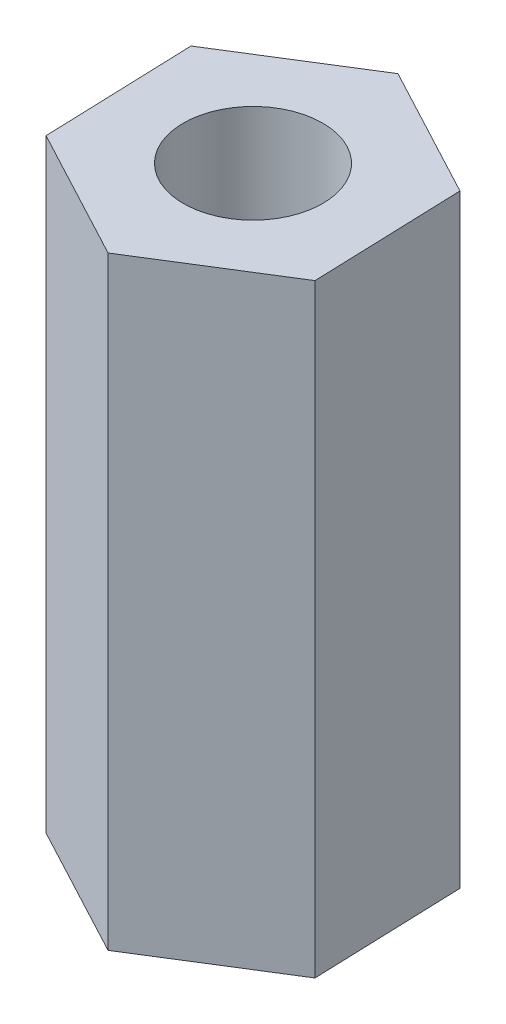
ISO-10303-21;
HEADER;
FILE_DESCRIPTION(('STEP AP214'),'2;1');
FILE_NAME('part.step','',(''),(''),'','','');
FILE_SCHEMA(('AUTOMOTIVE_DESIGN { 1 0 10303 214 1 1 1 1 }'));
ENDSEC;
DATA;
#1=APPLICATION_CONTEXT('core data for automotive mechanical design processes');
#2=APPLICATION_PROTOCOL_DEFINITION('international standard','automotive_design',2000,#1);
#3=PRODUCT_CONTEXT('',#1,'mechanical');
#4=PRODUCT('Part','Part','',(#3));
#5=PRODUCT_RELATED_PRODUCT_CATEGORY('part','',(#4));
#6=PRODUCT_DEFINITION_FORMATION('','',#4);
#7=PRODUCT_DEFINITION_CONTEXT('part definition',#1,'design');
#8=PRODUCT_DEFINITION('design','',#6,#7);
#9=PRODUCT_DEFINITION_SHAPE('','',#8);
#10=(LENGTH_UNIT() NAMED_UNIT(*) SI_UNIT(.MILLI.,.METRE.));
#11=(NAMED_UNIT(*) PLANE_ANGLE_UNIT() SI_UNIT($,.RADIAN.));
#12=(NAMED_UNIT(*) SI_UNIT($,.STERADIAN.) SOLID_ANGLE_UNIT());
#13=UNCERTAINTY_MEASURE_WITH_UNIT(LENGTH_MEASURE(1.E-05),#10,'distance_accuracy_value','');
#14=(GEOMETRIC_REPRESENTATION_CONTEXT(3) GLOBAL_UNCERTAINTY_ASSIGNED_CONTEXT((#13)) GLOBAL_UNIT_ASSIGNED_CONTEXT((#10,
#11,#12)) REPRESENTATION_CONTEXT('',''));
#15=CARTESIAN_POINT('',(0.,0.,0.));
#16=DIRECTION('',(0.,0.,1.));
#17=DIRECTION('',(1.,0.,0.));
#18=AXIS2_PLACEMENT_3D('',#15,#16,#17);
#19=CARTESIAN_POINT('',(0.,13.,0.));
#20=DIRECTION('',(0.,1.,0.));
#21=DIRECTION('',(0.,0.,1.));
#22=AXIS2_PLACEMENT_3D('',#19,#20,#21);
#23=PLANE('',#22);
#24=DIRECTION('',(0.848274620016122,0.,-0.529556577748312));
#25=VECTOR('',#24,1.);
#26=CARTESIAN_POINT('',(0.111453993098776,13.,3.23123990764472));
#27=LINE('',#26,#25);
#28=CARTESIAN_POINT('',(0.111453993098776,13.,3.23123990764472));
#29=VERTEX_POINT('',#28);
#30=CARTESIAN_POINT('',(2.8540628422918,13.,1.5190979644456));
#31=VERTEX_POINT('',#30);
#32=EDGE_CURVE('E137',#29,#31,#27,.T.);
#33=ORIENTED_EDGE('',*,*,#32,.T.);
#34=DIRECTION('',(-0.0344721390631268,0.,-0.999405659193709));
#35=VECTOR('',#34,1.);
#36=CARTESIAN_POINT('',(2.8540628422918,13.,1.5190979644456));
#37=LINE('',#36,#35);
#38=CARTESIAN_POINT('',(2.74260884919302,13.,-1.71214194319912));
#39=VERTEX_POINT('',#38);
#40=EDGE_CURVE('E95',#31,#39,#37,.T.);
#41=ORIENTED_EDGE('',*,*,#40,.T.);
#42=DIRECTION('',(-0.882746759079248,0.,-0.469849081445397));
#43=VECTOR('',#42,1.);
#44=CARTESIAN_POINT('',(2.74260884919302,13.,-1.71214194319912));
#45=LINE('',#44,#43);
#46=CARTESIAN_POINT('',(-0.111453993098776,13.,-3.23123990764472));
#47=VERTEX_POINT('',#46);
#48=EDGE_CURVE('E108',#39,#47,#45,.T.);
#49=ORIENTED_EDGE('',*,*,#48,.T.);
#50=DIRECTION('',(-0.848274620016122,0.,0.529556577748312));
#51=VECTOR('',#50,1.);
#52=CARTESIAN_POINT('',(-0.111453993098776,13.,-3.23123990764472));
#53=LINE('',#52,#51);
#54=CARTESIAN_POINT('',(-2.8540628422918,13.,-1.5190979644456));
#55=VERTEX_POINT('',#54);
#56=EDGE_CURVE('E102',#47,#55,#53,.T.);
#57=ORIENTED_EDGE('',*,*,#56,.T.);
#58=DIRECTION('',(0.0344721390631268,0.,0.999405659193709));
#59=VECTOR('',#58,1.);
#60=CARTESIAN_POINT('',(-2.8540628422918,13.,-1.5190979644456));
#61=LINE('',#60,#59);
#62=CARTESIAN_POINT('',(-2.74260884919302,13.,1.71214194319912));
#63=VERTEX_POINT('',#62);
#64=EDGE_CURVE('E106',#55,#63,#61,.T.);
#65=ORIENTED_EDGE('',*,*,#64,.T.);
#66=DIRECTION('',(0.882746759079248,0.,0.469849081445397));
#67=VECTOR('',#66,1.);
#68=CARTESIAN_POINT('',(-2.74260884919302,13.,1.71214194319912));
#69=LINE('',#68,#67);
#70=EDGE_CURVE('E58',#63,#29,#69,.T.);
#71=ORIENTED_EDGE('',*,*,#70,.T.);
#72=EDGE_LOOP('',(#33,#41,#49,#57,#65,#71));
#73=FACE_BOUND('',#72,.T.);
#74=CARTESIAN_POINT('',(0.,13.,0.));
#75=DIRECTION('',(0.,1.,0.));
#76=DIRECTION('',(0.,0.,1.));
#77=AXIS2_PLACEMENT_3D('',#74,#75,#76);
#78=CIRCLE('',#77,1.5);
#79=CARTESIAN_POINT('',(0.,13.,-1.5));
#80=VERTEX_POINT('',#79);
#81=EDGE_CURVE('E130',#80,#80,#78,.T.);
#82=ORIENTED_EDGE('',*,*,#81,.F.);
#83=EDGE_LOOP('',(#82));
#84=FACE_BOUND('',#83,.T.);
#85=ADVANCED_FACE('F41',(#73,#84),#23,.T.);
#86=CARTESIAN_POINT('',(0.,0.,0.));
#87=DIRECTION('',(0.,1.,0.));
#88=DIRECTION('',(0.,0.,1.));
#89=AXIS2_PLACEMENT_3D('',#86,#87,#88);
#90=PLANE('',#89);
#91=DIRECTION('',(0.848274620016122,0.,-0.529556577748312));
#92=VECTOR('',#91,1.);
#93=CARTESIAN_POINT('',(0.111453993098776,0.,3.23123990764472));
#94=LINE('',#93,#92);
#95=CARTESIAN_POINT('',(0.111453993098776,0.,3.23123990764472));
#96=VERTEX_POINT('',#95);
#97=CARTESIAN_POINT('',(2.8540628422918,0.,1.5190979644456));
#98=VERTEX_POINT('',#97);
#99=EDGE_CURVE('E126',#96,#98,#94,.T.);
#100=ORIENTED_EDGE('',*,*,#99,.F.);
#101=DIRECTION('',(0.882746759079248,0.,0.469849081445397));
#102=VECTOR('',#101,1.);
#103=CARTESIAN_POINT('',(-2.74260884919302,0.,1.71214194319912));
#104=LINE('',#103,#102);
#105=CARTESIAN_POINT('',(-2.74260884919302,0.,1.71214194319912));
#106=VERTEX_POINT('',#105);
#107=EDGE_CURVE('E87',#106,#96,#104,.T.);
#108=ORIENTED_EDGE('',*,*,#107,.F.);
#109=DIRECTION('',(0.0344721390631268,0.,0.999405659193709));
#110=VECTOR('',#109,1.);
#111=CARTESIAN_POINT('',(-2.8540628422918,0.,-1.5190979644456));
#112=LINE('',#111,#110);
#113=CARTESIAN_POINT('',(-2.8540628422918,0.,-1.5190979644456));
#114=VERTEX_POINT('',#113);
#115=EDGE_CURVE('E81',#114,#106,#112,.T.);
#116=ORIENTED_EDGE('',*,*,#115,.F.);
#117=DIRECTION('',(-0.848274620016122,0.,0.529556577748312));
#118=VECTOR('',#117,1.);
#119=CARTESIAN_POINT('',(-0.111453993098776,0.,-3.23123990764472));
#120=LINE('',#119,#118);
#121=CARTESIAN_POINT('',(-0.111453993098776,0.,-3.23123990764472));
#122=VERTEX_POINT('',#121);
#123=EDGE_CURVE('E116',#122,#114,#120,.T.);
#124=ORIENTED_EDGE('',*,*,#123,.F.);
#125=DIRECTION('',(-0.882746759079248,0.,-0.469849081445397));
#126=VECTOR('',#125,1.);
#127=CARTESIAN_POINT('',(2.74260884919302,0.,-1.71214194319912));
#128=LINE('',#127,#126);
#129=CARTESIAN_POINT('',(2.74260884919302,0.,-1.71214194319912));
#130=VERTEX_POINT('',#129);
#131=EDGE_CURVE('E132',#130,#122,#128,.T.);
#132=ORIENTED_EDGE('',*,*,#131,.F.);
#133=DIRECTION('',(-0.0344721390631268,0.,-0.999405659193709));
#134=VECTOR('',#133,1.);
#135=CARTESIAN_POINT('',(2.8540628422918,0.,1.5190979644456));
#136=LINE('',#135,#134);
#137=EDGE_CURVE('E129',#98,#130,#136,.T.);
#138=ORIENTED_EDGE('',*,*,#137,.F.);
#139=EDGE_LOOP('',(#100,#108,#116,#124,#132,#138));
#140=FACE_BOUND('',#139,.T.);
#141=CARTESIAN_POINT('',(0.,0.,0.));
#142=DIRECTION('',(0.,1.,0.));
#143=DIRECTION('',(0.,0.,1.));
#144=AXIS2_PLACEMENT_3D('',#141,#142,#143);
#145=CIRCLE('',#144,1.5);
#146=CARTESIAN_POINT('',(0.,0.,-1.5));
#147=VERTEX_POINT('',#146);
#148=EDGE_CURVE('E230',#147,#147,#145,.T.);
#149=ORIENTED_EDGE('',*,*,#148,.T.);
#150=EDGE_LOOP('',(#149));
#151=FACE_BOUND('',#150,.T.);
#152=ADVANCED_FACE('F146',(#140,#151),#90,.F.);
#153=CARTESIAN_POINT('',(0.111453993098776,13.,3.23123990764472));
#154=DIRECTION('',(-0.529556577748312,0.,-0.848274620016122));
#155=DIRECTION('',(-0.848274620016122,0.,0.529556577748312));
#156=AXIS2_PLACEMENT_3D('',#153,#154,#155);
#157=PLANE('',#156);
#158=ORIENTED_EDGE('',*,*,#99,.T.);
#159=DIRECTION('',(0.,-1.,0.));
#160=VECTOR('',#159,1.);
#161=CARTESIAN_POINT('',(2.8540628422918,13.,1.5190979644456));
#162=LINE('',#161,#160);
#163=EDGE_CURVE('E11',#31,#98,#162,.T.);
#164=ORIENTED_EDGE('',*,*,#163,.F.);
#165=ORIENTED_EDGE('',*,*,#32,.F.);
#166=DIRECTION('',(0.,-1.,0.));
#167=VECTOR('',#166,1.);
#168=CARTESIAN_POINT('',(0.111453993098776,13.,3.23123990764472));
#169=LINE('',#168,#167);
#170=EDGE_CURVE('E122',#29,#96,#169,.T.);
#171=ORIENTED_EDGE('',*,*,#170,.T.);
#172=EDGE_LOOP('',(#158,#164,#165,#171));
#173=FACE_BOUND('',#172,.T.);
#174=ADVANCED_FACE('F43',(#173),#157,.F.);
#175=CARTESIAN_POINT('',(2.8540628422918,13.,1.5190979644456));
#176=DIRECTION('',(-0.999405659193709,0.,0.0344721390631268));
#177=DIRECTION('',(0.0344721390631268,0.,0.999405659193709));
#178=AXIS2_PLACEMENT_3D('',#175,#176,#177);
#179=PLANE('',#178);
#180=ORIENTED_EDGE('',*,*,#137,.T.);
#181=DIRECTION('',(0.,-1.,0.));
#182=VECTOR('',#181,1.);
#183=CARTESIAN_POINT('',(2.74260884919302,13.,-1.71214194319912));
#184=LINE('',#183,#182);
#185=EDGE_CURVE('E50',#39,#130,#184,.T.);
#186=ORIENTED_EDGE('',*,*,#185,.F.);
#187=ORIENTED_EDGE('',*,*,#40,.F.);
#188=ORIENTED_EDGE('',*,*,#163,.T.);
#189=EDGE_LOOP('',(#180,#186,#187,#188));
#190=FACE_BOUND('',#189,.T.);
#191=ADVANCED_FACE('F171',(#190),#179,.F.);
#192=CARTESIAN_POINT('',(2.74260884919302,13.,-1.71214194319912));
#193=DIRECTION('',(-0.469849081445397,0.,0.882746759079248));
#194=DIRECTION('',(0.882746759079249,0.,0.469849081445397));
#195=AXIS2_PLACEMENT_3D('',#192,#193,#194);
#196=PLANE('',#195);
#197=ORIENTED_EDGE('',*,*,#131,.T.);
#198=DIRECTION('',(0.,-1.,0.));
#199=VECTOR('',#198,1.);
#200=CARTESIAN_POINT('',(-0.111453993098776,13.,-3.23123990764472));
#201=LINE('',#200,#199);
#202=EDGE_CURVE('E117',#47,#122,#201,.T.);
#203=ORIENTED_EDGE('',*,*,#202,.F.);
#204=ORIENTED_EDGE('',*,*,#48,.F.);
#205=ORIENTED_EDGE('',*,*,#185,.T.);
#206=EDGE_LOOP('',(#197,#203,#204,#205));
#207=FACE_BOUND('',#206,.T.);
#208=ADVANCED_FACE('F143',(#207),#196,.F.);
#209=CARTESIAN_POINT('',(-0.111453993098776,13.,-3.23123990764472));
#210=DIRECTION('',(0.529556577748312,0.,0.848274620016122));
#211=DIRECTION('',(0.848274620016122,0.,-0.529556577748312));
#212=AXIS2_PLACEMENT_3D('',#209,#210,#211);
#213=PLANE('',#212);
#214=ORIENTED_EDGE('',*,*,#123,.T.);
#215=DIRECTION('',(0.,-1.,0.));
#216=VECTOR('',#215,1.);
#217=CARTESIAN_POINT('',(-2.8540628422918,13.,-1.5190979644456));
#218=LINE('',#217,#216);
#219=EDGE_CURVE('E113',#55,#114,#218,.T.);
#220=ORIENTED_EDGE('',*,*,#219,.F.);
#221=ORIENTED_EDGE('',*,*,#56,.F.);
#222=ORIENTED_EDGE('',*,*,#202,.T.);
#223=EDGE_LOOP('',(#214,#220,#221,#222));
#224=FACE_BOUND('',#223,.T.);
#225=ADVANCED_FACE('F114',(#224),#213,.F.);
#226=CARTESIAN_POINT('',(-2.8540628422918,13.,-1.5190979644456));
#227=DIRECTION('',(0.999405659193709,0.,-0.0344721390631268));
#228=DIRECTION('',(-0.0344721390631268,0.,-0.999405659193709));
#229=AXIS2_PLACEMENT_3D('',#226,#227,#228);
#230=PLANE('',#229);
#231=ORIENTED_EDGE('',*,*,#115,.T.);
#232=DIRECTION('',(0.,-1.,0.));
#233=VECTOR('',#232,1.);
#234=CARTESIAN_POINT('',(-2.74260884919302,13.,1.71214194319912));
#235=LINE('',#234,#233);
#236=EDGE_CURVE('E118',#63,#106,#235,.T.);
#237=ORIENTED_EDGE('',*,*,#236,.F.);
#238=ORIENTED_EDGE('',*,*,#64,.F.);
#239=ORIENTED_EDGE('',*,*,#219,.T.);
#240=EDGE_LOOP('',(#231,#237,#238,#239));
#241=FACE_BOUND('',#240,.T.);
#242=ADVANCED_FACE('F120',(#241),#230,.F.);
#243=CARTESIAN_POINT('',(-2.74260884919302,13.,1.71214194319912));
#244=DIRECTION('',(0.469849081445397,0.,-0.882746759079248));
#245=DIRECTION('',(-0.882746759079248,0.,-0.469849081445397));
#246=AXIS2_PLACEMENT_3D('',#243,#244,#245);
#247=PLANE('',#246);
#248=ORIENTED_EDGE('',*,*,#107,.T.);
#249=ORIENTED_EDGE('',*,*,#170,.F.);
#250=ORIENTED_EDGE('',*,*,#70,.F.);
#251=ORIENTED_EDGE('',*,*,#236,.T.);
#252=EDGE_LOOP('',(#248,#249,#250,#251));
#253=FACE_BOUND('',#252,.T.);
#254=ADVANCED_FACE('F151',(#253),#247,.F.);
#255=CARTESIAN_POINT('',(0.,13.,0.));
#256=DIRECTION('',(0.,-1.,0.));
#257=DIRECTION('',(0.,0.,-1.));
#258=AXIS2_PLACEMENT_3D('',#255,#256,#257);
#259=CYLINDRICAL_SURFACE('',#258,1.5);
#260=CARTESIAN_POINT('',(0.,13.,-1.5));
#261=CARTESIAN_POINT('',(0.,12.8645833333333,-1.5));
#262=CARTESIAN_POINT('',(0.,12.7291666666667,-1.5));
#263=CARTESIAN_POINT('',(0.,12.4583333333333,-1.5));
#264=CARTESIAN_POINT('',(0.,12.3229166666667,-1.5));
#265=CARTESIAN_POINT('',(0.,12.0520833333333,-1.5));
#266=CARTESIAN_POINT('',(0.,11.9166666666667,-1.5));
#267=CARTESIAN_POINT('',(0.,11.6458333333333,-1.5));
#268=CARTESIAN_POINT('',(0.,11.5104166666667,-1.5));
#269=CARTESIAN_POINT('',(0.,11.2395833333333,-1.5));
#270=CARTESIAN_POINT('',(0.,11.1041666666667,-1.5));
#271=CARTESIAN_POINT('',(0.,10.8333333333333,-1.5));
#272=CARTESIAN_POINT('',(0.,10.6979166666667,-1.5));
#273=CARTESIAN_POINT('',(0.,10.4270833333333,-1.5));
#274=CARTESIAN_POINT('',(0.,10.2916666666667,-1.5));
#275=CARTESIAN_POINT('',(0.,10.0208333333333,-1.5));
#276=CARTESIAN_POINT('',(0.,9.88541666666667,-1.5));
#277=CARTESIAN_POINT('',(0.,9.61458333333333,-1.5));
#278=CARTESIAN_POINT('',(0.,9.47916666666667,-1.5));
#279=CARTESIAN_POINT('',(0.,9.20833333333333,-1.5));
#280=CARTESIAN_POINT('',(0.,9.07291666666666,-1.5));
#281=CARTESIAN_POINT('',(0.,8.80208333333333,-1.5));
#282=CARTESIAN_POINT('',(0.,8.66666666666667,-1.5));
#283=CARTESIAN_POINT('',(0.,8.39583333333333,-1.5));
#284=CARTESIAN_POINT('',(0.,8.26041666666667,-1.5));
#285=CARTESIAN_POINT('',(0.,7.98958333333333,-1.5));
#286=CARTESIAN_POINT('',(0.,7.85416666666667,-1.5));
#287=CARTESIAN_POINT('',(0.,7.58333333333333,-1.5));
#288=CARTESIAN_POINT('',(0.,7.44791666666667,-1.5));
#289=CARTESIAN_POINT('',(0.,7.17708333333333,-1.5));
#290=CARTESIAN_POINT('',(0.,7.04166666666667,-1.5));
#291=CARTESIAN_POINT('',(0.,6.77083333333333,-1.5));
#292=CARTESIAN_POINT('',(0.,6.63541666666667,-1.5));
#293=CARTESIAN_POINT('',(0.,6.36458333333333,-1.5));
#294=CARTESIAN_POINT('',(0.,6.22916666666667,-1.5));
#295=CARTESIAN_POINT('',(0.,5.95833333333333,-1.5));
#296=CARTESIAN_POINT('',(0.,5.82291666666667,-1.5));
#297=CARTESIAN_POINT('',(0.,5.55208333333333,-1.5));
#298=CARTESIAN_POINT('',(0.,5.41666666666667,-1.5));
#299=CARTESIAN_POINT('',(0.,5.14583333333333,-1.5));
#300=CARTESIAN_POINT('',(0.,5.01041666666667,-1.5));
#301=CARTESIAN_POINT('',(0.,4.73958333333333,-1.5));
#302=CARTESIAN_POINT('',(0.,4.60416666666667,-1.5));
#303=CARTESIAN_POINT('',(0.,4.33333333333333,-1.5));
#304=CARTESIAN_POINT('',(0.,4.19791666666667,-1.5));
#305=CARTESIAN_POINT('',(0.,3.92708333333333,-1.5));
#306=CARTESIAN_POINT('',(0.,3.79166666666667,-1.5));
#307=CARTESIAN_POINT('',(0.,3.52083333333333,-1.5));
#308=CARTESIAN_POINT('',(0.,3.38541666666667,-1.5));
#309=CARTESIAN_POINT('',(0.,3.11458333333333,-1.5));
#310=CARTESIAN_POINT('',(0.,2.97916666666667,-1.5));
#311=CARTESIAN_POINT('',(0.,2.70833333333333,-1.5));
#312=CARTESIAN_POINT('',(0.,2.57291666666667,-1.5));
#313=CARTESIAN_POINT('',(0.,2.30208333333333,-1.5));
#314=CARTESIAN_POINT('',(0.,2.16666666666667,-1.5));
#315=CARTESIAN_POINT('',(0.,1.89583333333333,-1.5));
#316=CARTESIAN_POINT('',(0.,1.76041666666667,-1.5));
#317=CARTESIAN_POINT('',(0.,1.48958333333333,-1.5));
#318=CARTESIAN_POINT('',(0.,1.35416666666667,-1.5));
#319=CARTESIAN_POINT('',(0.,1.08333333333333,-1.5));
#320=CARTESIAN_POINT('',(0.,0.947916666666667,-1.5));
#321=CARTESIAN_POINT('',(0.,0.677083333333334,-1.5));
#322=CARTESIAN_POINT('',(0.,0.541666666666667,-1.5));
#323=CARTESIAN_POINT('',(0.,0.270833333333334,-1.5));
#324=CARTESIAN_POINT('',(0.,0.135416666666667,-1.5));
#325=CARTESIAN_POINT('',(0.,0.,-1.5));
#326=B_SPLINE_CURVE_WITH_KNOTS('',3,(#260,#261,#262,#263,#264,#265,#266,#267,#268,#269,#270,
#271,#272,#273,#274,#275,#276,#277,#278,#279,#280,#281,#282,#283,#284,#285,#286,#287,#288,#289,
#290,#291,#292,#293,#294,#295,#296,#297,#298,#299,#300,#301,#302,#303,#304,#305,#306,#307,#308,
#309,#310,#311,#312,#313,#314,#315,#316,#317,#318,#319,#320,#321,#322,#323,#324,#325),
.UNSPECIFIED.,.F.,.F.,(4,2,2,2,2,2,2,2,2,2,2,2,2,2,2,2,2,2,2,2,2,2,2,2,2,2,2,2,2,2,2,2,4),(0.,
0.40625,0.812500000000001,1.21875,1.625,2.03125,2.4375,2.84375,3.25,3.65625,4.0625,4.46875,
4.875,5.28125,5.6875,6.09375,6.5,6.90625,7.3125,7.71875,8.125,8.53125,8.9375,9.34375,9.75,
10.15625,10.5625,10.96875,11.375,11.78125,12.1875,12.59375,13.),.UNSPECIFIED.);
#327=EDGE_CURVE('BSEAM153',#80,#147,#326,.T.);
#328=ORIENTED_EDGE('',*,*,#81,.T.);
#329=ORIENTED_EDGE('',*,*,#148,.F.);
#330=ORIENTED_EDGE('',*,*,#327,.T.);
#331=ORIENTED_EDGE('',*,*,#327,.F.);
#332=EDGE_LOOP('',(#328,#330,#329,#331));
#333=FACE_BOUND('',#332,.T.);
#334=ADVANCED_FACE('F153',(#333),#259,.F.);
#335=CLOSED_SHELL('',(#85,#152,#174,#191,#208,#225,#242,#254,#334));
#336=MANIFOLD_SOLID_BREP('B2',#335);
#337=ADVANCED_BREP_SHAPE_REPRESENTATION('',(#18,#336),#14);
#338=SHAPE_DEFINITION_REPRESENTATION(#9,#337);
ENDSEC;
END-ISO-10303-21;
